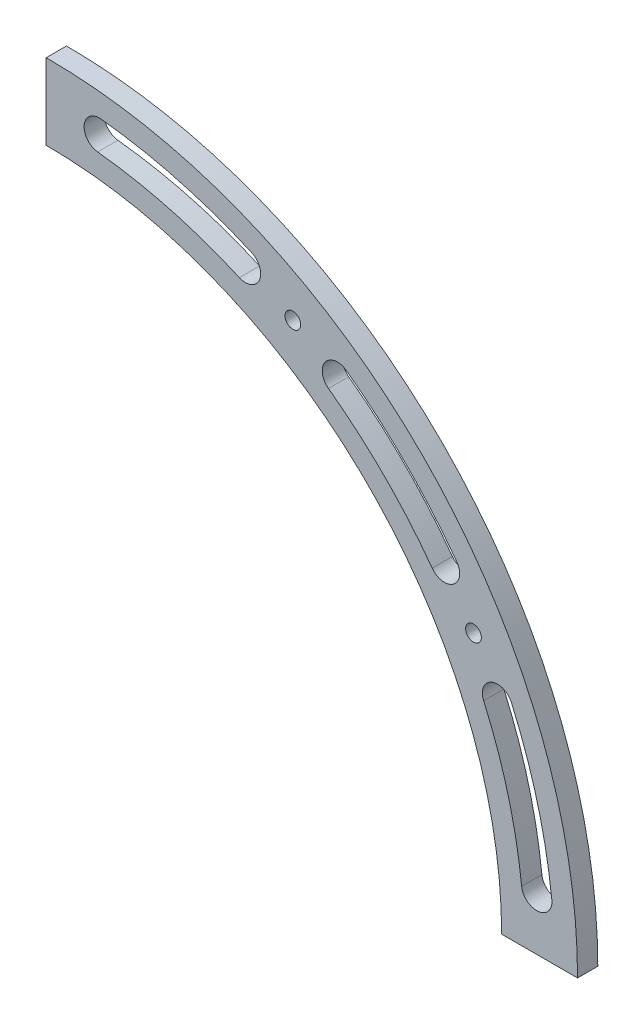
ISO-10303-21;
HEADER;
FILE_DESCRIPTION(('STEP AP214'),'2;1');
FILE_NAME('part.step','',(''),(''),'','','');
FILE_SCHEMA(('AUTOMOTIVE_DESIGN { 1 0 10303 214 1 1 1 1 }'));
ENDSEC;
DATA;
#1=APPLICATION_CONTEXT('core data for automotive mechanical design processes');
#2=APPLICATION_PROTOCOL_DEFINITION('international standard','automotive_design',2000,#1);
#3=PRODUCT_CONTEXT('',#1,'mechanical');
#4=PRODUCT('Part','Part','',(#3));
#5=PRODUCT_RELATED_PRODUCT_CATEGORY('part','',(#4));
#6=PRODUCT_DEFINITION_FORMATION('','',#4);
#7=PRODUCT_DEFINITION_CONTEXT('part definition',#1,'design');
#8=PRODUCT_DEFINITION('design','',#6,#7);
#9=PRODUCT_DEFINITION_SHAPE('','',#8);
#10=(LENGTH_UNIT() NAMED_UNIT(*) SI_UNIT(.MILLI.,.METRE.));
#11=(NAMED_UNIT(*) PLANE_ANGLE_UNIT() SI_UNIT($,.RADIAN.));
#12=(NAMED_UNIT(*) SI_UNIT($,.STERADIAN.) SOLID_ANGLE_UNIT());
#13=UNCERTAINTY_MEASURE_WITH_UNIT(LENGTH_MEASURE(1.E-05),#10,'distance_accuracy_value','');
#14=(GEOMETRIC_REPRESENTATION_CONTEXT(3) GLOBAL_UNCERTAINTY_ASSIGNED_CONTEXT((#13)) GLOBAL_UNIT_ASSIGNED_CONTEXT((#10,
#11,#12)) REPRESENTATION_CONTEXT('',''));
#15=CARTESIAN_POINT('',(0.,0.,0.));
#16=DIRECTION('',(0.,0.,1.));
#17=DIRECTION('',(1.,0.,0.));
#18=AXIS2_PLACEMENT_3D('',#15,#16,#17);
#19=CARTESIAN_POINT('',(0.,0.,0.));
#20=DIRECTION('',(0.,0.,1.));
#21=DIRECTION('',(-1.,0.,0.));
#22=AXIS2_PLACEMENT_3D('',#19,#20,#21);
#23=PLANE('',#22);
#24=CARTESIAN_POINT('',(39.382176801012,89.1924556810375,0.));
#25=DIRECTION('',(0.,0.,-1.));
#26=DIRECTION('',(-1.,0.,0.));
#27=AXIS2_PLACEMENT_3D('',#24,#25,#26);
#28=CIRCLE('',#27,3.);
#29=CARTESIAN_POINT('',(40.593936087197,91.9368389327617,0.));
#30=VERTEX_POINT('',#29);
#31=CARTESIAN_POINT('',(38.170417514827,86.4480724293132,0.));
#32=VERTEX_POINT('',#31);
#33=EDGE_CURVE('E11',#30,#32,#28,.T.);
#34=ORIENTED_EDGE('',*,*,#33,.T.);
#35=CARTESIAN_POINT('',(0.,0.,0.));
#36=DIRECTION('',(0.,0.,-1.));
#37=DIRECTION('',(-1.,0.,0.));
#38=AXIS2_PLACEMENT_3D('',#35,#36,#37);
#39=CIRCLE('',#38,94.5);
#40=CARTESIAN_POINT('',(10.1674849737587,93.9514355893958,0.));
#41=VERTEX_POINT('',#40);
#42=EDGE_CURVE('E51',#32,#41,#39,.F.);
#43=ORIENTED_EDGE('',*,*,#42,.T.);
#44=CARTESIAN_POINT('',(10.4902622745129,96.934020846202,0.));
#45=DIRECTION('',(0.,0.,-1.));
#46=DIRECTION('',(-1.,0.,0.));
#47=AXIS2_PLACEMENT_3D('',#44,#45,#46);
#48=CIRCLE('',#47,3.);
#49=CARTESIAN_POINT('',(10.8130395752672,99.9166061030083,0.));
#50=VERTEX_POINT('',#49);
#51=EDGE_CURVE('E219',#41,#50,#48,.T.);
#52=ORIENTED_EDGE('',*,*,#51,.T.);
#53=CARTESIAN_POINT('',(0.,0.,0.));
#54=DIRECTION('',(0.,0.,-1.));
#55=DIRECTION('',(-1.,0.,0.));
#56=AXIS2_PLACEMENT_3D('',#53,#54,#55);
#57=CIRCLE('',#56,100.5);
#58=EDGE_CURVE('E208',#50,#30,#57,.T.);
#59=ORIENTED_EDGE('',*,*,#58,.T.);
#60=EDGE_LOOP('',(#34,#43,#52,#59));
#61=FACE_BOUND('',#60,.T.);
#62=CARTESIAN_POINT('',(84.4374768689824,48.7500000000007,0.));
#63=DIRECTION('',(0.,0.,-1.));
#64=DIRECTION('',(-1.,0.,0.));
#65=AXIS2_PLACEMENT_3D('',#62,#63,#64);
#66=CIRCLE('',#65,1.54999999999999);
#67=CARTESIAN_POINT('',(82.8874768689824,48.7500000000007,0.));
#68=VERTEX_POINT('',#67);
#69=EDGE_CURVE('E212',#68,#68,#66,.T.);
#70=ORIENTED_EDGE('',*,*,#69,.T.);
#71=EDGE_LOOP('',(#70));
#72=FACE_BOUND('',#71,.T.);
#73=CARTESIAN_POINT('',(48.7500000000004,84.4374768689825,0.));
#74=DIRECTION('',(0.,0.,-1.));
#75=DIRECTION('',(-1.,0.,0.));
#76=AXIS2_PLACEMENT_3D('',#73,#74,#75);
#77=CIRCLE('',#76,1.54999999999999);
#78=CARTESIAN_POINT('',(47.2000000000004,84.4374768689825,0.));
#79=VERTEX_POINT('',#78);
#80=EDGE_CURVE('E209',#79,#79,#77,.T.);
#81=ORIENTED_EDGE('',*,*,#80,.T.);
#82=EDGE_LOOP('',(#81));
#83=FACE_BOUND('',#82,.T.);
#84=CARTESIAN_POINT('',(96.9340208462021,10.4902622745126,0.));
#85=DIRECTION('',(0.,0.,-1.));
#86=DIRECTION('',(-1.,0.,0.));
#87=AXIS2_PLACEMENT_3D('',#84,#85,#86);
#88=CIRCLE('',#87,3.);
#89=CARTESIAN_POINT('',(99.9166061030083,10.8130395752669,0.));
#90=VERTEX_POINT('',#89);
#91=CARTESIAN_POINT('',(93.9514355893959,10.1674849737584,0.));
#92=VERTEX_POINT('',#91);
#93=EDGE_CURVE('E205',#90,#92,#88,.T.);
#94=ORIENTED_EDGE('',*,*,#93,.T.);
#95=CARTESIAN_POINT('',(0.,0.,0.));
#96=DIRECTION('',(0.,0.,-1.));
#97=DIRECTION('',(-1.,0.,0.));
#98=AXIS2_PLACEMENT_3D('',#95,#96,#97);
#99=CIRCLE('',#98,94.5);
#100=CARTESIAN_POINT('',(86.4480724293134,38.1704175148268,0.));
#101=VERTEX_POINT('',#100);
#102=EDGE_CURVE('E202',#92,#101,#99,.F.);
#103=ORIENTED_EDGE('',*,*,#102,.T.);
#104=CARTESIAN_POINT('',(89.1924556810376,39.3821768010117,0.));
#105=DIRECTION('',(0.,0.,-1.));
#106=DIRECTION('',(-1.,0.,0.));
#107=AXIS2_PLACEMENT_3D('',#104,#105,#106);
#108=CIRCLE('',#107,3.);
#109=CARTESIAN_POINT('',(91.9368389327618,40.5939360871967,0.));
#110=VERTEX_POINT('',#109);
#111=EDGE_CURVE('E199',#101,#110,#108,.T.);
#112=ORIENTED_EDGE('',*,*,#111,.T.);
#113=CARTESIAN_POINT('',(0.,0.,0.));
#114=DIRECTION('',(0.,0.,-1.));
#115=DIRECTION('',(-1.,0.,0.));
#116=AXIS2_PLACEMENT_3D('',#113,#114,#115);
#117=CIRCLE('',#116,100.5);
#118=EDGE_CURVE('E196',#110,#90,#117,.T.);
#119=ORIENTED_EDGE('',*,*,#118,.T.);
#120=EDGE_LOOP('',(#94,#103,#112,#119));
#121=FACE_BOUND('',#120,.T.);
#122=CARTESIAN_POINT('',(78.702193406525,57.5518440451906,0.));
#123=DIRECTION('',(0.,0.,-1.));
#124=DIRECTION('',(-1.,0.,0.));
#125=AXIS2_PLACEMENT_3D('',#122,#123,#124);
#126=CIRCLE('',#125,2.99999999999999);
#127=CARTESIAN_POINT('',(81.1237993574949,59.3226700158118,0.));
#128=VERTEX_POINT('',#127);
#129=CARTESIAN_POINT('',(76.280587455555,55.7810180745693,0.));
#130=VERTEX_POINT('',#129);
#131=EDGE_CURVE('E193',#128,#130,#126,.T.);
#132=ORIENTED_EDGE('',*,*,#131,.T.);
#133=CARTESIAN_POINT('',(0.,0.,0.));
#134=DIRECTION('',(0.,0.,-1.));
#135=DIRECTION('',(-1.,0.,0.));
#136=AXIS2_PLACEMENT_3D('',#133,#134,#135);
#137=CIRCLE('',#136,94.5);
#138=CARTESIAN_POINT('',(55.781018074569,76.2805874555552,0.));
#139=VERTEX_POINT('',#138);
#140=EDGE_CURVE('E190',#130,#139,#137,.F.);
#141=ORIENTED_EDGE('',*,*,#140,.T.);
#142=CARTESIAN_POINT('',(57.5518440451903,78.7021934065252,0.));
#143=DIRECTION('',(0.,0.,-1.));
#144=DIRECTION('',(-1.,0.,0.));
#145=AXIS2_PLACEMENT_3D('',#142,#143,#144);
#146=CIRCLE('',#145,2.99999999999999);
#147=CARTESIAN_POINT('',(59.3226700158115,81.1237993574952,0.));
#148=VERTEX_POINT('',#147);
#149=EDGE_CURVE('E182',#139,#148,#146,.T.);
#150=ORIENTED_EDGE('',*,*,#149,.T.);
#151=CARTESIAN_POINT('',(0.,0.,0.));
#152=DIRECTION('',(0.,0.,-1.));
#153=DIRECTION('',(-1.,0.,0.));
#154=AXIS2_PLACEMENT_3D('',#151,#152,#153);
#155=CIRCLE('',#154,100.5);
#156=EDGE_CURVE('E178',#148,#128,#155,.T.);
#157=ORIENTED_EDGE('',*,*,#156,.T.);
#158=EDGE_LOOP('',(#132,#141,#150,#157));
#159=FACE_BOUND('',#158,.T.);
#160=CARTESIAN_POINT('',(0.,0.,0.));
#161=DIRECTION('',(0.,0.,1.));
#162=DIRECTION('',(-1.,0.,0.));
#163=AXIS2_PLACEMENT_3D('',#160,#161,#162);
#164=CIRCLE('',#163,105.);
#165=CARTESIAN_POINT('',(105.,0.,0.));
#166=VERTEX_POINT('',#165);
#167=CARTESIAN_POINT('',(0.,105.,0.));
#168=VERTEX_POINT('',#167);
#169=EDGE_CURVE('E216',#166,#168,#164,.T.);
#170=ORIENTED_EDGE('',*,*,#169,.T.);
#171=DIRECTION('',(0.,-1.,0.));
#172=VECTOR('',#171,1.);
#173=CARTESIAN_POINT('',(0.,105.,0.));
#174=LINE('',#173,#172);
#175=CARTESIAN_POINT('',(0.,90.,0.));
#176=VERTEX_POINT('',#175);
#177=EDGE_CURVE('E176',#168,#176,#174,.T.);
#178=ORIENTED_EDGE('',*,*,#177,.T.);
#179=CARTESIAN_POINT('',(0.,0.,0.));
#180=DIRECTION('',(0.,0.,-1.));
#181=DIRECTION('',(-1.,0.,0.));
#182=AXIS2_PLACEMENT_3D('',#179,#180,#181);
#183=CIRCLE('',#182,90.);
#184=CARTESIAN_POINT('',(90.,0.,0.));
#185=VERTEX_POINT('',#184);
#186=EDGE_CURVE('E284',#176,#185,#183,.T.);
#187=ORIENTED_EDGE('',*,*,#186,.T.);
#188=DIRECTION('',(-1.,0.,0.));
#189=VECTOR('',#188,1.);
#190=CARTESIAN_POINT('',(0.,0.,0.));
#191=LINE('',#190,#189);
#192=EDGE_CURVE('E254',#166,#185,#191,.T.);
#193=ORIENTED_EDGE('',*,*,#192,.F.);
#194=EDGE_LOOP('',(#170,#178,#187,#193));
#195=FACE_BOUND('',#194,.T.);
#196=ADVANCED_FACE('F43',(#61,#72,#83,#121,#159,#195),#23,.T.);
#197=CARTESIAN_POINT('',(0.,0.,-15.));
#198=DIRECTION('',(0.,0.,1.));
#199=DIRECTION('',(-1.,0.,0.));
#200=AXIS2_PLACEMENT_3D('',#197,#198,#199);
#201=CYLINDRICAL_SURFACE('',#200,105.);
#202=DIRECTION('',(0.,0.,1.));
#203=VECTOR('',#202,1.);
#204=CARTESIAN_POINT('',(0.,105.,-15.));
#205=LINE('',#204,#203);
#206=CARTESIAN_POINT('',(0.,105.,-4.));
#207=VERTEX_POINT('',#206);
#208=EDGE_CURVE('E170',#207,#168,#205,.T.);
#209=ORIENTED_EDGE('',*,*,#208,.T.);
#210=ORIENTED_EDGE('',*,*,#169,.F.);
#211=DIRECTION('',(0.,0.,1.));
#212=VECTOR('',#211,1.);
#213=CARTESIAN_POINT('',(105.,0.,-15.));
#214=LINE('',#213,#212);
#215=CARTESIAN_POINT('',(105.,0.,-4.));
#216=VERTEX_POINT('',#215);
#217=EDGE_CURVE('E172',#216,#166,#214,.T.);
#218=ORIENTED_EDGE('',*,*,#217,.F.);
#219=CARTESIAN_POINT('',(0.,0.,-4.));
#220=DIRECTION('',(0.,0.,1.));
#221=DIRECTION('',(-1.,0.,0.));
#222=AXIS2_PLACEMENT_3D('',#219,#220,#221);
#223=CIRCLE('',#222,105.);
#224=EDGE_CURVE('E160',#216,#207,#223,.T.);
#225=ORIENTED_EDGE('',*,*,#224,.T.);
#226=EDGE_LOOP('',(#209,#210,#218,#225));
#227=FACE_BOUND('',#226,.T.);
#228=ADVANCED_FACE('F45',(#227),#201,.T.);
#229=CARTESIAN_POINT('',(0.,105.,-15.));
#230=DIRECTION('',(1.,0.,0.));
#231=DIRECTION('',(0.,1.,0.));
#232=AXIS2_PLACEMENT_3D('',#229,#230,#231);
#233=PLANE('',#232);
#234=DIRECTION('',(0.,0.,1.));
#235=VECTOR('',#234,1.);
#236=CARTESIAN_POINT('',(0.,90.,-15.));
#237=LINE('',#236,#235);
#238=CARTESIAN_POINT('',(0.,90.,-4.));
#239=VERTEX_POINT('',#238);
#240=EDGE_CURVE('E179',#239,#176,#237,.T.);
#241=ORIENTED_EDGE('',*,*,#240,.T.);
#242=ORIENTED_EDGE('',*,*,#177,.F.);
#243=ORIENTED_EDGE('',*,*,#208,.F.);
#244=DIRECTION('',(0.,-1.,0.));
#245=VECTOR('',#244,1.);
#246=CARTESIAN_POINT('',(0.,105.,-4.));
#247=LINE('',#246,#245);
#248=EDGE_CURVE('E156',#207,#239,#247,.T.);
#249=ORIENTED_EDGE('',*,*,#248,.T.);
#250=EDGE_LOOP('',(#241,#242,#243,#249));
#251=FACE_BOUND('',#250,.T.);
#252=ADVANCED_FACE('F174',(#251),#233,.F.);
#253=CARTESIAN_POINT('',(0.,0.,-15.));
#254=DIRECTION('',(0.,0.,1.));
#255=DIRECTION('',(-1.,0.,0.));
#256=AXIS2_PLACEMENT_3D('',#253,#254,#255);
#257=CYLINDRICAL_SURFACE('',#256,90.);
#258=DIRECTION('',(0.,0.,1.));
#259=VECTOR('',#258,1.);
#260=CARTESIAN_POINT('',(90.,0.,-15.));
#261=LINE('',#260,#259);
#262=CARTESIAN_POINT('',(90.,0.,-4.));
#263=VERTEX_POINT('',#262);
#264=EDGE_CURVE('E184',#263,#185,#261,.T.);
#265=ORIENTED_EDGE('',*,*,#264,.T.);
#266=ORIENTED_EDGE('',*,*,#186,.F.);
#267=ORIENTED_EDGE('',*,*,#240,.F.);
#268=CARTESIAN_POINT('',(0.,0.,-4.));
#269=DIRECTION('',(0.,0.,-1.));
#270=DIRECTION('',(-1.,0.,0.));
#271=AXIS2_PLACEMENT_3D('',#268,#269,#270);
#272=CIRCLE('',#271,90.);
#273=EDGE_CURVE('E163',#239,#263,#272,.T.);
#274=ORIENTED_EDGE('',*,*,#273,.T.);
#275=EDGE_LOOP('',(#265,#266,#267,#274));
#276=FACE_BOUND('',#275,.T.);
#277=ADVANCED_FACE('F291',(#276),#257,.F.);
#278=CARTESIAN_POINT('',(78.702193406525,57.5518440451906,50.));
#279=DIRECTION('',(0.,0.,-1.));
#280=DIRECTION('',(1.,0.,0.));
#281=AXIS2_PLACEMENT_3D('',#278,#279,#280);
#282=CYLINDRICAL_SURFACE('',#281,2.99999999999999);
#283=DIRECTION('',(0.,0.,-1.));
#284=VECTOR('',#283,1.);
#285=CARTESIAN_POINT('',(76.280587455555,55.7810180745693,50.));
#286=LINE('',#285,#284);
#287=CARTESIAN_POINT('',(76.280587455555,55.7810180745693,-4.));
#288=VERTEX_POINT('',#287);
#289=EDGE_CURVE('E267',#130,#288,#286,.T.);
#290=ORIENTED_EDGE('',*,*,#289,.F.);
#291=ORIENTED_EDGE('',*,*,#131,.F.);
#292=DIRECTION('',(0.,0.,-1.));
#293=VECTOR('',#292,1.);
#294=CARTESIAN_POINT('',(81.1237993574949,59.3226700158118,50.));
#295=LINE('',#294,#293);
#296=CARTESIAN_POINT('',(81.1237993574949,59.3226700158118,-4.));
#297=VERTEX_POINT('',#296);
#298=EDGE_CURVE('E258',#128,#297,#295,.T.);
#299=ORIENTED_EDGE('',*,*,#298,.T.);
#300=CARTESIAN_POINT('',(78.702193406525,57.5518440451906,-4.));
#301=DIRECTION('',(0.,0.,-1.));
#302=DIRECTION('',(-1.,0.,0.));
#303=AXIS2_PLACEMENT_3D('',#300,#301,#302);
#304=CIRCLE('',#303,2.99999999999999);
#305=EDGE_CURVE('E296',#288,#297,#304,.F.);
#306=ORIENTED_EDGE('',*,*,#305,.F.);
#307=EDGE_LOOP('',(#290,#291,#299,#306));
#308=FACE_BOUND('',#307,.T.);
#309=ADVANCED_FACE('F307',(#308),#282,.F.);
#310=CARTESIAN_POINT('',(0.,0.,50.));
#311=DIRECTION('',(0.,0.,-1.));
#312=DIRECTION('',(1.,0.,0.));
#313=AXIS2_PLACEMENT_3D('',#310,#311,#312);
#314=CYLINDRICAL_SURFACE('',#313,94.5);
#315=DIRECTION('',(0.,0.,-1.));
#316=VECTOR('',#315,1.);
#317=CARTESIAN_POINT('',(55.781018074569,76.2805874555552,50.));
#318=LINE('',#317,#316);
#319=CARTESIAN_POINT('',(55.781018074569,76.2805874555552,-4.));
#320=VERTEX_POINT('',#319);
#321=EDGE_CURVE('E264',#139,#320,#318,.T.);
#322=ORIENTED_EDGE('',*,*,#321,.F.);
#323=ORIENTED_EDGE('',*,*,#140,.F.);
#324=ORIENTED_EDGE('',*,*,#289,.T.);
#325=CARTESIAN_POINT('',(0.,0.,-4.));
#326=DIRECTION('',(0.,0.,-1.));
#327=DIRECTION('',(-1.,0.,0.));
#328=AXIS2_PLACEMENT_3D('',#325,#326,#327);
#329=CIRCLE('',#328,94.5);
#330=EDGE_CURVE('E502',#320,#288,#329,.T.);
#331=ORIENTED_EDGE('',*,*,#330,.F.);
#332=EDGE_LOOP('',(#322,#323,#324,#331));
#333=FACE_BOUND('',#332,.T.);
#334=ADVANCED_FACE('F325',(#333),#314,.T.);
#335=CARTESIAN_POINT('',(57.5518440451903,78.7021934065252,50.));
#336=DIRECTION('',(0.,0.,-1.));
#337=DIRECTION('',(1.,0.,0.));
#338=AXIS2_PLACEMENT_3D('',#335,#336,#337);
#339=CYLINDRICAL_SURFACE('',#338,2.99999999999999);
#340=DIRECTION('',(0.,0.,-1.));
#341=VECTOR('',#340,1.);
#342=CARTESIAN_POINT('',(59.3226700158115,81.1237993574952,50.));
#343=LINE('',#342,#341);
#344=CARTESIAN_POINT('',(59.3226700158115,81.1237993574952,-4.));
#345=VERTEX_POINT('',#344);
#346=EDGE_CURVE('E261',#148,#345,#343,.T.);
#347=ORIENTED_EDGE('',*,*,#346,.F.);
#348=ORIENTED_EDGE('',*,*,#149,.F.);
#349=ORIENTED_EDGE('',*,*,#321,.T.);
#350=CARTESIAN_POINT('',(57.5518440451903,78.7021934065252,-4.));
#351=DIRECTION('',(0.,0.,-1.));
#352=DIRECTION('',(-1.,0.,0.));
#353=AXIS2_PLACEMENT_3D('',#350,#351,#352);
#354=CIRCLE('',#353,2.99999999999999);
#355=EDGE_CURVE('E500',#345,#320,#354,.F.);
#356=ORIENTED_EDGE('',*,*,#355,.F.);
#357=EDGE_LOOP('',(#347,#348,#349,#356));
#358=FACE_BOUND('',#357,.T.);
#359=ADVANCED_FACE('F334',(#358),#339,.F.);
#360=CARTESIAN_POINT('',(0.,0.,50.));
#361=DIRECTION('',(0.,0.,-1.));
#362=DIRECTION('',(1.,0.,0.));
#363=AXIS2_PLACEMENT_3D('',#360,#361,#362);
#364=CYLINDRICAL_SURFACE('',#363,100.5);
#365=ORIENTED_EDGE('',*,*,#298,.F.);
#366=ORIENTED_EDGE('',*,*,#156,.F.);
#367=ORIENTED_EDGE('',*,*,#346,.T.);
#368=CARTESIAN_POINT('',(0.,0.,-4.));
#369=DIRECTION('',(0.,0.,-1.));
#370=DIRECTION('',(-1.,0.,0.));
#371=AXIS2_PLACEMENT_3D('',#368,#369,#370);
#372=CIRCLE('',#371,100.5);
#373=EDGE_CURVE('E58',#297,#345,#372,.F.);
#374=ORIENTED_EDGE('',*,*,#373,.F.);
#375=EDGE_LOOP('',(#365,#366,#367,#374));
#376=FACE_BOUND('',#375,.T.);
#377=ADVANCED_FACE('F343',(#376),#364,.F.);
#378=CARTESIAN_POINT('',(96.9340208462021,10.4902622745126,50.));
#379=DIRECTION('',(0.,0.,-1.));
#380=DIRECTION('',(1.,0.,0.));
#381=AXIS2_PLACEMENT_3D('',#378,#379,#380);
#382=CYLINDRICAL_SURFACE('',#381,3.);
#383=DIRECTION('',(0.,0.,-1.));
#384=VECTOR('',#383,1.);
#385=CARTESIAN_POINT('',(93.9514355893959,10.1674849737584,50.));
#386=LINE('',#385,#384);
#387=CARTESIAN_POINT('',(93.9514355893959,10.1674849737584,-4.));
#388=VERTEX_POINT('',#387);
#389=EDGE_CURVE('E279',#92,#388,#386,.T.);
#390=ORIENTED_EDGE('',*,*,#389,.F.);
#391=ORIENTED_EDGE('',*,*,#93,.F.);
#392=DIRECTION('',(0.,0.,-1.));
#393=VECTOR('',#392,1.);
#394=CARTESIAN_POINT('',(99.9166061030083,10.8130395752669,50.));
#395=LINE('',#394,#393);
#396=CARTESIAN_POINT('',(99.9166061030083,10.8130395752669,-4.));
#397=VERTEX_POINT('',#396);
#398=EDGE_CURVE('E270',#90,#397,#395,.T.);
#399=ORIENTED_EDGE('',*,*,#398,.T.);
#400=CARTESIAN_POINT('',(96.9340208462021,10.4902622745126,-4.));
#401=DIRECTION('',(0.,0.,-1.));
#402=DIRECTION('',(-1.,0.,0.));
#403=AXIS2_PLACEMENT_3D('',#400,#401,#402);
#404=CIRCLE('',#403,3.);
#405=EDGE_CURVE('E497',#388,#397,#404,.F.);
#406=ORIENTED_EDGE('',*,*,#405,.F.);
#407=EDGE_LOOP('',(#390,#391,#399,#406));
#408=FACE_BOUND('',#407,.T.);
#409=ADVANCED_FACE('F352',(#408),#382,.F.);
#410=CARTESIAN_POINT('',(0.,0.,50.));
#411=DIRECTION('',(0.,0.,-1.));
#412=DIRECTION('',(1.,0.,0.));
#413=AXIS2_PLACEMENT_3D('',#410,#411,#412);
#414=CYLINDRICAL_SURFACE('',#413,94.5);
#415=DIRECTION('',(0.,0.,-1.));
#416=VECTOR('',#415,1.);
#417=CARTESIAN_POINT('',(86.4480724293134,38.1704175148268,50.));
#418=LINE('',#417,#416);
#419=CARTESIAN_POINT('',(86.4480724293134,38.1704175148268,-4.));
#420=VERTEX_POINT('',#419);
#421=EDGE_CURVE('E276',#101,#420,#418,.T.);
#422=ORIENTED_EDGE('',*,*,#421,.F.);
#423=ORIENTED_EDGE('',*,*,#102,.F.);
#424=ORIENTED_EDGE('',*,*,#389,.T.);
#425=CARTESIAN_POINT('',(0.,0.,-4.));
#426=DIRECTION('',(0.,0.,-1.));
#427=DIRECTION('',(-1.,0.,0.));
#428=AXIS2_PLACEMENT_3D('',#425,#426,#427);
#429=CIRCLE('',#428,94.5);
#430=EDGE_CURVE('E495',#420,#388,#429,.T.);
#431=ORIENTED_EDGE('',*,*,#430,.F.);
#432=EDGE_LOOP('',(#422,#423,#424,#431));
#433=FACE_BOUND('',#432,.T.);
#434=ADVANCED_FACE('F304',(#433),#414,.T.);
#435=CARTESIAN_POINT('',(89.1924556810376,39.3821768010117,50.));
#436=DIRECTION('',(0.,0.,-1.));
#437=DIRECTION('',(1.,0.,0.));
#438=AXIS2_PLACEMENT_3D('',#435,#436,#437);
#439=CYLINDRICAL_SURFACE('',#438,3.);
#440=DIRECTION('',(0.,0.,-1.));
#441=VECTOR('',#440,1.);
#442=CARTESIAN_POINT('',(91.9368389327619,40.5939360871967,50.));
#443=LINE('',#442,#441);
#444=CARTESIAN_POINT('',(91.9368389327619,40.5939360871967,-4.));
#445=VERTEX_POINT('',#444);
#446=EDGE_CURVE('E273',#110,#445,#443,.T.);
#447=ORIENTED_EDGE('',*,*,#446,.F.);
#448=ORIENTED_EDGE('',*,*,#111,.F.);
#449=ORIENTED_EDGE('',*,*,#421,.T.);
#450=CARTESIAN_POINT('',(89.1924556810376,39.3821768010117,-4.));
#451=DIRECTION('',(0.,0.,-1.));
#452=DIRECTION('',(-1.,0.,0.));
#453=AXIS2_PLACEMENT_3D('',#450,#451,#452);
#454=CIRCLE('',#453,3.);
#455=EDGE_CURVE('E493',#445,#420,#454,.F.);
#456=ORIENTED_EDGE('',*,*,#455,.F.);
#457=EDGE_LOOP('',(#447,#448,#449,#456));
#458=FACE_BOUND('',#457,.T.);
#459=ADVANCED_FACE('F369',(#458),#439,.F.);
#460=CARTESIAN_POINT('',(0.,0.,50.));
#461=DIRECTION('',(0.,0.,-1.));
#462=DIRECTION('',(1.,0.,0.));
#463=AXIS2_PLACEMENT_3D('',#460,#461,#462);
#464=CYLINDRICAL_SURFACE('',#463,100.5);
#465=ORIENTED_EDGE('',*,*,#398,.F.);
#466=ORIENTED_EDGE('',*,*,#118,.F.);
#467=ORIENTED_EDGE('',*,*,#446,.T.);
#468=CARTESIAN_POINT('',(0.,0.,-4.));
#469=DIRECTION('',(0.,0.,-1.));
#470=DIRECTION('',(-1.,0.,0.));
#471=AXIS2_PLACEMENT_3D('',#468,#469,#470);
#472=CIRCLE('',#471,100.5);
#473=EDGE_CURVE('E66',#397,#445,#472,.F.);
#474=ORIENTED_EDGE('',*,*,#473,.F.);
#475=EDGE_LOOP('',(#465,#466,#467,#474));
#476=FACE_BOUND('',#475,.T.);
#477=ADVANCED_FACE('F377',(#476),#464,.F.);
#478=CARTESIAN_POINT('',(48.7500000000004,84.4374768689825,50.));
#479=DIRECTION('',(0.,0.,-1.));
#480=DIRECTION('',(1.,0.,0.));
#481=AXIS2_PLACEMENT_3D('',#478,#479,#480);
#482=CYLINDRICAL_SURFACE('',#481,1.54999999999999);
#483=CARTESIAN_POINT('',(48.7500000000004,84.4374768689825,-4.));
#484=DIRECTION('',(0.,0.,-1.));
#485=DIRECTION('',(-1.,0.,0.));
#486=AXIS2_PLACEMENT_3D('',#483,#484,#485);
#487=CIRCLE('',#486,1.54999999999999);
#488=CARTESIAN_POINT('',(47.2000000000004,84.4374768689825,-4.));
#489=VERTEX_POINT('',#488);
#490=EDGE_CURVE('E485',#489,#489,#487,.F.);
#491=ORIENTED_EDGE('',*,*,#490,.F.);
#492=EDGE_LOOP('',(#491));
#493=FACE_BOUND('',#492,.T.);
#494=ORIENTED_EDGE('',*,*,#80,.F.);
#495=EDGE_LOOP('',(#494));
#496=FACE_BOUND('',#495,.T.);
#497=ADVANCED_FACE('F385',(#493,#496),#482,.F.);
#498=CARTESIAN_POINT('',(84.4374768689824,48.7500000000007,50.));
#499=DIRECTION('',(0.,0.,-1.));
#500=DIRECTION('',(1.,0.,0.));
#501=AXIS2_PLACEMENT_3D('',#498,#499,#500);
#502=CYLINDRICAL_SURFACE('',#501,1.54999999999999);
#503=CARTESIAN_POINT('',(84.4374768689824,48.7500000000007,-4.));
#504=DIRECTION('',(0.,0.,-1.));
#505=DIRECTION('',(-1.,0.,0.));
#506=AXIS2_PLACEMENT_3D('',#503,#504,#505);
#507=CIRCLE('',#506,1.54999999999999);
#508=CARTESIAN_POINT('',(82.8874768689824,48.7500000000007,-4.));
#509=VERTEX_POINT('',#508);
#510=EDGE_CURVE('E484',#509,#509,#507,.F.);
#511=ORIENTED_EDGE('',*,*,#510,.F.);
#512=EDGE_LOOP('',(#511));
#513=FACE_BOUND('',#512,.T.);
#514=ORIENTED_EDGE('',*,*,#69,.F.);
#515=EDGE_LOOP('',(#514));
#516=FACE_BOUND('',#515,.T.);
#517=ADVANCED_FACE('F394',(#513,#516),#502,.F.);
#518=CARTESIAN_POINT('',(39.382176801012,89.1924556810375,50.));
#519=DIRECTION('',(0.,0.,-1.));
#520=DIRECTION('',(1.,0.,0.));
#521=AXIS2_PLACEMENT_3D('',#518,#519,#520);
#522=CYLINDRICAL_SURFACE('',#521,3.);
#523=DIRECTION('',(0.,0.,-1.));
#524=VECTOR('',#523,1.);
#525=CARTESIAN_POINT('',(38.170417514827,86.4480724293132,50.));
#526=LINE('',#525,#524);
#527=CARTESIAN_POINT('',(38.170417514827,86.4480724293132,-4.));
#528=VERTEX_POINT('',#527);
#529=EDGE_CURVE('E213',#32,#528,#526,.T.);
#530=ORIENTED_EDGE('',*,*,#529,.F.);
#531=ORIENTED_EDGE('',*,*,#33,.F.);
#532=DIRECTION('',(0.,0.,-1.));
#533=VECTOR('',#532,1.);
#534=CARTESIAN_POINT('',(40.593936087197,91.9368389327617,50.));
#535=LINE('',#534,#533);
#536=CARTESIAN_POINT('',(40.593936087197,91.9368389327617,-4.));
#537=VERTEX_POINT('',#536);
#538=EDGE_CURVE('E243',#30,#537,#535,.T.);
#539=ORIENTED_EDGE('',*,*,#538,.T.);
#540=CARTESIAN_POINT('',(39.382176801012,89.1924556810375,-4.));
#541=DIRECTION('',(0.,0.,-1.));
#542=DIRECTION('',(-1.,0.,0.));
#543=AXIS2_PLACEMENT_3D('',#540,#541,#542);
#544=CIRCLE('',#543,3.);
#545=EDGE_CURVE('E251',#528,#537,#544,.F.);
#546=ORIENTED_EDGE('',*,*,#545,.F.);
#547=EDGE_LOOP('',(#530,#531,#539,#546));
#548=FACE_BOUND('',#547,.T.);
#549=ADVANCED_FACE('F248',(#548),#522,.F.);
#550=CARTESIAN_POINT('',(0.,0.,50.));
#551=DIRECTION('',(0.,0.,-1.));
#552=DIRECTION('',(1.,0.,0.));
#553=AXIS2_PLACEMENT_3D('',#550,#551,#552);
#554=CYLINDRICAL_SURFACE('',#553,94.5);
#555=DIRECTION('',(0.,0.,-1.));
#556=VECTOR('',#555,1.);
#557=CARTESIAN_POINT('',(10.1674849737587,93.9514355893958,50.));
#558=LINE('',#557,#556);
#559=CARTESIAN_POINT('',(10.1674849737587,93.9514355893958,-4.));
#560=VERTEX_POINT('',#559);
#561=EDGE_CURVE('E232',#41,#560,#558,.T.);
#562=ORIENTED_EDGE('',*,*,#561,.F.);
#563=ORIENTED_EDGE('',*,*,#42,.F.);
#564=ORIENTED_EDGE('',*,*,#529,.T.);
#565=CARTESIAN_POINT('',(0.,0.,-4.));
#566=DIRECTION('',(0.,0.,-1.));
#567=DIRECTION('',(-1.,0.,0.));
#568=AXIS2_PLACEMENT_3D('',#565,#566,#567);
#569=CIRCLE('',#568,94.5);
#570=EDGE_CURVE('E233',#560,#528,#569,.T.);
#571=ORIENTED_EDGE('',*,*,#570,.F.);
#572=EDGE_LOOP('',(#562,#563,#564,#571));
#573=FACE_BOUND('',#572,.T.);
#574=ADVANCED_FACE('F229',(#573),#554,.T.);
#575=CARTESIAN_POINT('',(10.4902622745129,96.934020846202,50.));
#576=DIRECTION('',(0.,0.,-1.));
#577=DIRECTION('',(1.,0.,0.));
#578=AXIS2_PLACEMENT_3D('',#575,#576,#577);
#579=CYLINDRICAL_SURFACE('',#578,3.);
#580=DIRECTION('',(0.,0.,-1.));
#581=VECTOR('',#580,1.);
#582=CARTESIAN_POINT('',(10.8130395752672,99.9166061030083,50.));
#583=LINE('',#582,#581);
#584=CARTESIAN_POINT('',(10.8130395752672,99.9166061030083,-4.));
#585=VERTEX_POINT('',#584);
#586=EDGE_CURVE('E236',#50,#585,#583,.T.);
#587=ORIENTED_EDGE('',*,*,#586,.F.);
#588=ORIENTED_EDGE('',*,*,#51,.F.);
#589=ORIENTED_EDGE('',*,*,#561,.T.);
#590=CARTESIAN_POINT('',(10.4902622745129,96.934020846202,-4.));
#591=DIRECTION('',(0.,0.,-1.));
#592=DIRECTION('',(-1.,0.,0.));
#593=AXIS2_PLACEMENT_3D('',#590,#591,#592);
#594=CIRCLE('',#593,3.);
#595=EDGE_CURVE('E241',#585,#560,#594,.F.);
#596=ORIENTED_EDGE('',*,*,#595,.F.);
#597=EDGE_LOOP('',(#587,#588,#589,#596));
#598=FACE_BOUND('',#597,.T.);
#599=ADVANCED_FACE('F238',(#598),#579,.F.);
#600=CARTESIAN_POINT('',(0.,0.,50.));
#601=DIRECTION('',(0.,0.,-1.));
#602=DIRECTION('',(1.,0.,0.));
#603=AXIS2_PLACEMENT_3D('',#600,#601,#602);
#604=CYLINDRICAL_SURFACE('',#603,100.5);
#605=ORIENTED_EDGE('',*,*,#538,.F.);
#606=ORIENTED_EDGE('',*,*,#58,.F.);
#607=ORIENTED_EDGE('',*,*,#586,.T.);
#608=CARTESIAN_POINT('',(0.,0.,-4.));
#609=DIRECTION('',(0.,0.,-1.));
#610=DIRECTION('',(-1.,0.,0.));
#611=AXIS2_PLACEMENT_3D('',#608,#609,#610);
#612=CIRCLE('',#611,100.5);
#613=EDGE_CURVE('E519',#537,#585,#612,.F.);
#614=ORIENTED_EDGE('',*,*,#613,.F.);
#615=EDGE_LOOP('',(#605,#606,#607,#614));
#616=FACE_BOUND('',#615,.T.);
#617=ADVANCED_FACE('F245',(#616),#604,.F.);
#618=CARTESIAN_POINT('',(90.,0.,50.0000000000005));
#619=DIRECTION('',(0.,-1.,0.));
#620=DIRECTION('',(0.,0.,1.));
#621=AXIS2_PLACEMENT_3D('',#618,#619,#620);
#622=PLANE('',#621);
#623=DIRECTION('',(1.,0.,0.));
#624=VECTOR('',#623,1.);
#625=CARTESIAN_POINT('',(90.,0.,-4.));
#626=LINE('',#625,#624);
#627=EDGE_CURVE('E521',#263,#216,#626,.T.);
#628=ORIENTED_EDGE('',*,*,#627,.T.);
#629=ORIENTED_EDGE('',*,*,#217,.T.);
#630=ORIENTED_EDGE('',*,*,#192,.T.);
#631=ORIENTED_EDGE('',*,*,#264,.F.);
#632=EDGE_LOOP('',(#628,#629,#630,#631));
#633=FACE_BOUND('',#632,.T.);
#634=ADVANCED_FACE('F294',(#633),#622,.T.);
#635=CARTESIAN_POINT('',(0.,0.,-4.));
#636=DIRECTION('',(0.,0.,1.));
#637=DIRECTION('',(-1.,0.,0.));
#638=AXIS2_PLACEMENT_3D('',#635,#636,#637);
#639=PLANE('',#638);
#640=ORIENTED_EDGE('',*,*,#510,.T.);
#641=EDGE_LOOP('',(#640));
#642=FACE_BOUND('',#641,.T.);
#643=ORIENTED_EDGE('',*,*,#224,.F.);
#644=ORIENTED_EDGE('',*,*,#627,.F.);
#645=ORIENTED_EDGE('',*,*,#273,.F.);
#646=ORIENTED_EDGE('',*,*,#248,.F.);
#647=EDGE_LOOP('',(#643,#644,#645,#646));
#648=FACE_BOUND('',#647,.T.);
#649=ORIENTED_EDGE('',*,*,#570,.T.);
#650=ORIENTED_EDGE('',*,*,#545,.T.);
#651=ORIENTED_EDGE('',*,*,#613,.T.);
#652=ORIENTED_EDGE('',*,*,#595,.T.);
#653=EDGE_LOOP('',(#649,#650,#651,#652));
#654=FACE_BOUND('',#653,.T.);
#655=ORIENTED_EDGE('',*,*,#490,.T.);
#656=EDGE_LOOP('',(#655));
#657=FACE_BOUND('',#656,.T.);
#658=ORIENTED_EDGE('',*,*,#430,.T.);
#659=ORIENTED_EDGE('',*,*,#405,.T.);
#660=ORIENTED_EDGE('',*,*,#473,.T.);
#661=ORIENTED_EDGE('',*,*,#455,.T.);
#662=EDGE_LOOP('',(#658,#659,#660,#661));
#663=FACE_BOUND('',#662,.T.);
#664=ORIENTED_EDGE('',*,*,#330,.T.);
#665=ORIENTED_EDGE('',*,*,#305,.T.);
#666=ORIENTED_EDGE('',*,*,#373,.T.);
#667=ORIENTED_EDGE('',*,*,#355,.T.);
#668=EDGE_LOOP('',(#664,#665,#666,#667));
#669=FACE_BOUND('',#668,.T.);
#670=ADVANCED_FACE('F158',(#642,#648,#654,#657,#663,#669),#639,.F.);
#671=CLOSED_SHELL('',(#196,#228,#252,#277,#309,#334,#359,#377,#409,#434,#459,#477,#497,#517,
#549,#574,#599,#617,#634,#670));
#672=MANIFOLD_SOLID_BREP('B2',#671);
#673=ADVANCED_BREP_SHAPE_REPRESENTATION('',(#18,#672),#14);
#674=SHAPE_DEFINITION_REPRESENTATION(#9,#673);
ENDSEC;
END-ISO-10303-21;
